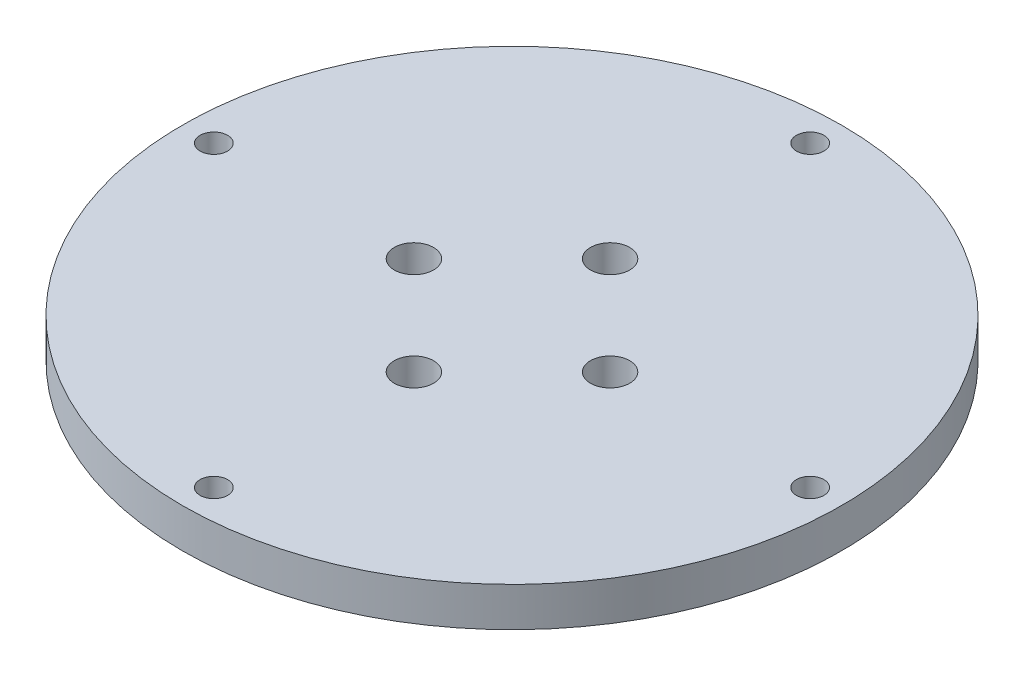
ISO-10303-21;
HEADER;
FILE_DESCRIPTION(('STEP AP214'),'2;1');
FILE_NAME('part.step','',(''),(''),'','','');
FILE_SCHEMA(('AUTOMOTIVE_DESIGN { 1 0 10303 214 1 1 1 1 }'));
ENDSEC;
DATA;
#1=APPLICATION_CONTEXT('core data for automotive mechanical design processes');
#2=APPLICATION_PROTOCOL_DEFINITION('international standard','automotive_design',2000,#1);
#3=PRODUCT_CONTEXT('',#1,'mechanical');
#4=PRODUCT('Part','Part','',(#3));
#5=PRODUCT_RELATED_PRODUCT_CATEGORY('part','',(#4));
#6=PRODUCT_DEFINITION_FORMATION('','',#4);
#7=PRODUCT_DEFINITION_CONTEXT('part definition',#1,'design');
#8=PRODUCT_DEFINITION('design','',#6,#7);
#9=PRODUCT_DEFINITION_SHAPE('','',#8);
#10=(LENGTH_UNIT() NAMED_UNIT(*) SI_UNIT(.MILLI.,.METRE.));
#11=(NAMED_UNIT(*) PLANE_ANGLE_UNIT() SI_UNIT($,.RADIAN.));
#12=(NAMED_UNIT(*) SI_UNIT($,.STERADIAN.) SOLID_ANGLE_UNIT());
#13=UNCERTAINTY_MEASURE_WITH_UNIT(LENGTH_MEASURE(1.E-05),#10,'distance_accuracy_value','');
#14=(GEOMETRIC_REPRESENTATION_CONTEXT(3) GLOBAL_UNCERTAINTY_ASSIGNED_CONTEXT((#13)) GLOBAL_UNIT_ASSIGNED_CONTEXT((#10,
#11,#12)) REPRESENTATION_CONTEXT('',''));
#15=CARTESIAN_POINT('',(0.,0.,0.));
#16=DIRECTION('',(0.,0.,1.));
#17=DIRECTION('',(1.,0.,0.));
#18=AXIS2_PLACEMENT_3D('',#15,#16,#17);
#19=CARTESIAN_POINT('',(0.,10.,0.));
#20=DIRECTION('',(0.,-1.,0.));
#21=DIRECTION('',(0.,0.,-1.));
#22=AXIS2_PLACEMENT_3D('',#19,#20,#21);
#23=CYLINDRICAL_SURFACE('',#22,84.);
#24=CARTESIAN_POINT('',(0.,10.,0.));
#25=DIRECTION('',(0.,1.,0.));
#26=DIRECTION('',(0.,0.,1.));
#27=AXIS2_PLACEMENT_3D('',#24,#25,#26);
#28=CIRCLE('',#27,84.);
#29=CARTESIAN_POINT('',(0.,10.,84.));
#30=VERTEX_POINT('',#29);
#31=EDGE_CURVE('E10',#30,#30,#28,.T.);
#32=ORIENTED_EDGE('',*,*,#31,.F.);
#33=EDGE_LOOP('',(#32));
#34=FACE_BOUND('',#33,.T.);
#35=CARTESIAN_POINT('',(0.,0.,0.));
#36=DIRECTION('',(0.,1.,0.));
#37=DIRECTION('',(0.,0.,1.));
#38=AXIS2_PLACEMENT_3D('',#35,#36,#37);
#39=CIRCLE('',#38,84.);
#40=CARTESIAN_POINT('',(0.,0.,84.));
#41=VERTEX_POINT('',#40);
#42=EDGE_CURVE('E34',#41,#41,#39,.T.);
#43=ORIENTED_EDGE('',*,*,#42,.T.);
#44=EDGE_LOOP('',(#43));
#45=FACE_BOUND('',#44,.T.);
#46=ADVANCED_FACE('F31',(#34,#45),#23,.T.);
#47=CARTESIAN_POINT('',(0.,10.,0.));
#48=DIRECTION('',(0.,1.,0.));
#49=DIRECTION('',(0.,0.,1.));
#50=AXIS2_PLACEMENT_3D('',#47,#48,#49);
#51=PLANE('',#50);
#52=CARTESIAN_POINT('',(0.,10.,-25.));
#53=DIRECTION('',(0.,1.,0.));
#54=DIRECTION('',(0.,0.,1.));
#55=AXIS2_PLACEMENT_3D('',#52,#53,#54);
#56=CIRCLE('',#55,5.);
#57=CARTESIAN_POINT('',(0.,10.,-20.));
#58=VERTEX_POINT('',#57);
#59=EDGE_CURVE('E85',#58,#58,#56,.T.);
#60=ORIENTED_EDGE('',*,*,#59,.F.);
#61=EDGE_LOOP('',(#60));
#62=FACE_BOUND('',#61,.T.);
#63=CARTESIAN_POINT('',(25.,10.,0.));
#64=DIRECTION('',(0.,1.,0.));
#65=DIRECTION('',(0.,0.,1.));
#66=AXIS2_PLACEMENT_3D('',#63,#64,#65);
#67=CIRCLE('',#66,5.);
#68=CARTESIAN_POINT('',(25.,10.,5.));
#69=VERTEX_POINT('',#68);
#70=EDGE_CURVE('E79',#69,#69,#67,.T.);
#71=ORIENTED_EDGE('',*,*,#70,.F.);
#72=EDGE_LOOP('',(#71));
#73=FACE_BOUND('',#72,.T.);
#74=CARTESIAN_POINT('',(-25.,10.,0.));
#75=DIRECTION('',(0.,1.,0.));
#76=DIRECTION('',(0.,0.,1.));
#77=AXIS2_PLACEMENT_3D('',#74,#75,#76);
#78=CIRCLE('',#77,5.);
#79=CARTESIAN_POINT('',(-25.,10.,5.));
#80=VERTEX_POINT('',#79);
#81=EDGE_CURVE('E73',#80,#80,#78,.T.);
#82=ORIENTED_EDGE('',*,*,#81,.F.);
#83=EDGE_LOOP('',(#82));
#84=FACE_BOUND('',#83,.T.);
#85=CARTESIAN_POINT('',(0.,10.,25.));
#86=DIRECTION('',(0.,1.,0.));
#87=DIRECTION('',(0.,0.,1.));
#88=AXIS2_PLACEMENT_3D('',#85,#86,#87);
#89=CIRCLE('',#88,5.);
#90=CARTESIAN_POINT('',(0.,10.,30.));
#91=VERTEX_POINT('',#90);
#92=EDGE_CURVE('E67',#91,#91,#89,.T.);
#93=ORIENTED_EDGE('',*,*,#92,.F.);
#94=EDGE_LOOP('',(#93));
#95=FACE_BOUND('',#94,.T.);
#96=CARTESIAN_POINT('',(0.,10.,-76.));
#97=DIRECTION('',(0.,1.,0.));
#98=DIRECTION('',(0.,0.,1.));
#99=AXIS2_PLACEMENT_3D('',#96,#97,#98);
#100=CIRCLE('',#99,3.49999999999999);
#101=CARTESIAN_POINT('',(0.,10.,-72.5));
#102=VERTEX_POINT('',#101);
#103=EDGE_CURVE('E63',#102,#102,#100,.T.);
#104=ORIENTED_EDGE('',*,*,#103,.F.);
#105=EDGE_LOOP('',(#104));
#106=FACE_BOUND('',#105,.T.);
#107=CARTESIAN_POINT('',(-76.,10.,0.));
#108=DIRECTION('',(0.,1.,0.));
#109=DIRECTION('',(0.,0.,1.));
#110=AXIS2_PLACEMENT_3D('',#107,#108,#109);
#111=CIRCLE('',#110,3.49999999999999);
#112=CARTESIAN_POINT('',(-76.,10.,3.49999999999999));
#113=VERTEX_POINT('',#112);
#114=EDGE_CURVE('E57',#113,#113,#111,.T.);
#115=ORIENTED_EDGE('',*,*,#114,.F.);
#116=EDGE_LOOP('',(#115));
#117=FACE_BOUND('',#116,.T.);
#118=CARTESIAN_POINT('',(0.,10.,76.));
#119=DIRECTION('',(0.,1.,0.));
#120=DIRECTION('',(0.,0.,1.));
#121=AXIS2_PLACEMENT_3D('',#118,#119,#120);
#122=CIRCLE('',#121,3.49999999999999);
#123=CARTESIAN_POINT('',(0.,10.,79.5));
#124=VERTEX_POINT('',#123);
#125=EDGE_CURVE('E51',#124,#124,#122,.T.);
#126=ORIENTED_EDGE('',*,*,#125,.F.);
#127=EDGE_LOOP('',(#126));
#128=FACE_BOUND('',#127,.T.);
#129=CARTESIAN_POINT('',(76.,10.,0.));
#130=DIRECTION('',(0.,1.,0.));
#131=DIRECTION('',(0.,0.,1.));
#132=AXIS2_PLACEMENT_3D('',#129,#130,#131);
#133=CIRCLE('',#132,3.49999999999999);
#134=CARTESIAN_POINT('',(76.,10.,3.49999999999999));
#135=VERTEX_POINT('',#134);
#136=EDGE_CURVE('E45',#135,#135,#133,.T.);
#137=ORIENTED_EDGE('',*,*,#136,.F.);
#138=EDGE_LOOP('',(#137));
#139=FACE_BOUND('',#138,.T.);
#140=ORIENTED_EDGE('',*,*,#31,.T.);
#141=EDGE_LOOP('',(#140));
#142=FACE_BOUND('',#141,.T.);
#143=ADVANCED_FACE('F101',(#62,#73,#84,#95,#106,#117,#128,#139,#142),#51,.T.);
#144=CARTESIAN_POINT('',(0.,0.,0.));
#145=DIRECTION('',(0.,1.,0.));
#146=DIRECTION('',(0.,0.,1.));
#147=AXIS2_PLACEMENT_3D('',#144,#145,#146);
#148=PLANE('',#147);
#149=CARTESIAN_POINT('',(0.,0.,-25.));
#150=DIRECTION('',(0.,1.,0.));
#151=DIRECTION('',(0.,0.,1.));
#152=AXIS2_PLACEMENT_3D('',#149,#150,#151);
#153=CIRCLE('',#152,5.);
#154=CARTESIAN_POINT('',(0.,0.,-20.));
#155=VERTEX_POINT('',#154);
#156=EDGE_CURVE('E66',#155,#155,#153,.T.);
#157=ORIENTED_EDGE('',*,*,#156,.T.);
#158=EDGE_LOOP('',(#157));
#159=FACE_BOUND('',#158,.T.);
#160=CARTESIAN_POINT('',(25.,0.,0.));
#161=DIRECTION('',(0.,1.,0.));
#162=DIRECTION('',(0.,0.,1.));
#163=AXIS2_PLACEMENT_3D('',#160,#161,#162);
#164=CIRCLE('',#163,5.);
#165=CARTESIAN_POINT('',(25.,0.,5.));
#166=VERTEX_POINT('',#165);
#167=EDGE_CURVE('E82',#166,#166,#164,.T.);
#168=ORIENTED_EDGE('',*,*,#167,.T.);
#169=EDGE_LOOP('',(#168));
#170=FACE_BOUND('',#169,.T.);
#171=CARTESIAN_POINT('',(-25.,0.,0.));
#172=DIRECTION('',(0.,1.,0.));
#173=DIRECTION('',(0.,0.,1.));
#174=AXIS2_PLACEMENT_3D('',#171,#172,#173);
#175=CIRCLE('',#174,5.);
#176=CARTESIAN_POINT('',(-25.,0.,5.));
#177=VERTEX_POINT('',#176);
#178=EDGE_CURVE('E76',#177,#177,#175,.T.);
#179=ORIENTED_EDGE('',*,*,#178,.T.);
#180=EDGE_LOOP('',(#179));
#181=FACE_BOUND('',#180,.T.);
#182=CARTESIAN_POINT('',(0.,0.,25.));
#183=DIRECTION('',(0.,1.,0.));
#184=DIRECTION('',(0.,0.,1.));
#185=AXIS2_PLACEMENT_3D('',#182,#183,#184);
#186=CIRCLE('',#185,5.);
#187=CARTESIAN_POINT('',(0.,0.,30.));
#188=VERTEX_POINT('',#187);
#189=EDGE_CURVE('E70',#188,#188,#186,.T.);
#190=ORIENTED_EDGE('',*,*,#189,.T.);
#191=EDGE_LOOP('',(#190));
#192=FACE_BOUND('',#191,.T.);
#193=CARTESIAN_POINT('',(0.,0.,-76.));
#194=DIRECTION('',(0.,1.,0.));
#195=DIRECTION('',(0.,0.,1.));
#196=AXIS2_PLACEMENT_3D('',#193,#194,#195);
#197=CIRCLE('',#196,3.49999999999999);
#198=CARTESIAN_POINT('',(0.,0.,-72.5));
#199=VERTEX_POINT('',#198);
#200=EDGE_CURVE('E60',#199,#199,#197,.T.);
#201=ORIENTED_EDGE('',*,*,#200,.T.);
#202=EDGE_LOOP('',(#201));
#203=FACE_BOUND('',#202,.T.);
#204=CARTESIAN_POINT('',(-76.,0.,0.));
#205=DIRECTION('',(0.,1.,0.));
#206=DIRECTION('',(0.,0.,1.));
#207=AXIS2_PLACEMENT_3D('',#204,#205,#206);
#208=CIRCLE('',#207,3.49999999999999);
#209=CARTESIAN_POINT('',(-76.,0.,3.49999999999999));
#210=VERTEX_POINT('',#209);
#211=EDGE_CURVE('E54',#210,#210,#208,.T.);
#212=ORIENTED_EDGE('',*,*,#211,.T.);
#213=EDGE_LOOP('',(#212));
#214=FACE_BOUND('',#213,.T.);
#215=CARTESIAN_POINT('',(0.,0.,76.));
#216=DIRECTION('',(0.,1.,0.));
#217=DIRECTION('',(0.,0.,1.));
#218=AXIS2_PLACEMENT_3D('',#215,#216,#217);
#219=CIRCLE('',#218,3.49999999999999);
#220=CARTESIAN_POINT('',(0.,0.,79.5));
#221=VERTEX_POINT('',#220);
#222=EDGE_CURVE('E48',#221,#221,#219,.T.);
#223=ORIENTED_EDGE('',*,*,#222,.T.);
#224=EDGE_LOOP('',(#223));
#225=FACE_BOUND('',#224,.T.);
#226=CARTESIAN_POINT('',(76.,0.,0.));
#227=DIRECTION('',(0.,1.,0.));
#228=DIRECTION('',(0.,0.,1.));
#229=AXIS2_PLACEMENT_3D('',#226,#227,#228);
#230=CIRCLE('',#229,3.49999999999999);
#231=CARTESIAN_POINT('',(76.,0.,3.49999999999999));
#232=VERTEX_POINT('',#231);
#233=EDGE_CURVE('E41',#232,#232,#230,.T.);
#234=ORIENTED_EDGE('',*,*,#233,.T.);
#235=EDGE_LOOP('',(#234));
#236=FACE_BOUND('',#235,.T.);
#237=ORIENTED_EDGE('',*,*,#42,.F.);
#238=EDGE_LOOP('',(#237));
#239=FACE_BOUND('',#238,.T.);
#240=ADVANCED_FACE('F91',(#159,#170,#181,#192,#203,#214,#225,#236,#239),#148,.F.);
#241=CARTESIAN_POINT('',(76.,10.,0.));
#242=DIRECTION('',(0.,1.,0.));
#243=DIRECTION('',(0.,0.,1.));
#244=AXIS2_PLACEMENT_3D('',#241,#242,#243);
#245=CYLINDRICAL_SURFACE('',#244,3.49999999999999);
#246=ORIENTED_EDGE('',*,*,#233,.F.);
#247=EDGE_LOOP('',(#246));
#248=FACE_BOUND('',#247,.T.);
#249=ORIENTED_EDGE('',*,*,#136,.T.);
#250=EDGE_LOOP('',(#249));
#251=FACE_BOUND('',#250,.T.);
#252=ADVANCED_FACE('F119',(#248,#251),#245,.F.);
#253=CARTESIAN_POINT('',(0.,10.,76.));
#254=DIRECTION('',(0.,1.,0.));
#255=DIRECTION('',(0.,0.,1.));
#256=AXIS2_PLACEMENT_3D('',#253,#254,#255);
#257=CYLINDRICAL_SURFACE('',#256,3.49999999999999);
#258=ORIENTED_EDGE('',*,*,#222,.F.);
#259=EDGE_LOOP('',(#258));
#260=FACE_BOUND('',#259,.T.);
#261=ORIENTED_EDGE('',*,*,#125,.T.);
#262=EDGE_LOOP('',(#261));
#263=FACE_BOUND('',#262,.T.);
#264=ADVANCED_FACE('F121',(#260,#263),#257,.F.);
#265=CARTESIAN_POINT('',(-76.,10.,0.));
#266=DIRECTION('',(0.,1.,0.));
#267=DIRECTION('',(0.,0.,1.));
#268=AXIS2_PLACEMENT_3D('',#265,#266,#267);
#269=CYLINDRICAL_SURFACE('',#268,3.49999999999999);
#270=ORIENTED_EDGE('',*,*,#211,.F.);
#271=EDGE_LOOP('',(#270));
#272=FACE_BOUND('',#271,.T.);
#273=ORIENTED_EDGE('',*,*,#114,.T.);
#274=EDGE_LOOP('',(#273));
#275=FACE_BOUND('',#274,.T.);
#276=ADVANCED_FACE('F128',(#272,#275),#269,.F.);
#277=CARTESIAN_POINT('',(0.,10.,-76.));
#278=DIRECTION('',(0.,1.,0.));
#279=DIRECTION('',(0.,0.,1.));
#280=AXIS2_PLACEMENT_3D('',#277,#278,#279);
#281=CYLINDRICAL_SURFACE('',#280,3.49999999999999);
#282=ORIENTED_EDGE('',*,*,#200,.F.);
#283=EDGE_LOOP('',(#282));
#284=FACE_BOUND('',#283,.T.);
#285=ORIENTED_EDGE('',*,*,#103,.T.);
#286=EDGE_LOOP('',(#285));
#287=FACE_BOUND('',#286,.T.);
#288=ADVANCED_FACE('F160',(#284,#287),#281,.F.);
#289=CARTESIAN_POINT('',(0.,0.,25.));
#290=DIRECTION('',(0.,1.,0.));
#291=DIRECTION('',(0.,0.,1.));
#292=AXIS2_PLACEMENT_3D('',#289,#290,#291);
#293=CYLINDRICAL_SURFACE('',#292,5.);
#294=ORIENTED_EDGE('',*,*,#189,.F.);
#295=EDGE_LOOP('',(#294));
#296=FACE_BOUND('',#295,.T.);
#297=ORIENTED_EDGE('',*,*,#92,.T.);
#298=EDGE_LOOP('',(#297));
#299=FACE_BOUND('',#298,.T.);
#300=ADVANCED_FACE('F154',(#296,#299),#293,.F.);
#301=CARTESIAN_POINT('',(-25.,0.,0.));
#302=DIRECTION('',(0.,1.,0.));
#303=DIRECTION('',(0.,0.,1.));
#304=AXIS2_PLACEMENT_3D('',#301,#302,#303);
#305=CYLINDRICAL_SURFACE('',#304,5.);
#306=ORIENTED_EDGE('',*,*,#178,.F.);
#307=EDGE_LOOP('',(#306));
#308=FACE_BOUND('',#307,.T.);
#309=ORIENTED_EDGE('',*,*,#81,.T.);
#310=EDGE_LOOP('',(#309));
#311=FACE_BOUND('',#310,.T.);
#312=ADVANCED_FACE('F159',(#308,#311),#305,.F.);
#313=CARTESIAN_POINT('',(25.,0.,0.));
#314=DIRECTION('',(0.,1.,0.));
#315=DIRECTION('',(0.,0.,1.));
#316=AXIS2_PLACEMENT_3D('',#313,#314,#315);
#317=CYLINDRICAL_SURFACE('',#316,5.);
#318=ORIENTED_EDGE('',*,*,#167,.F.);
#319=EDGE_LOOP('',(#318));
#320=FACE_BOUND('',#319,.T.);
#321=ORIENTED_EDGE('',*,*,#70,.T.);
#322=EDGE_LOOP('',(#321));
#323=FACE_BOUND('',#322,.T.);
#324=ADVANCED_FACE('F97',(#320,#323),#317,.F.);
#325=CARTESIAN_POINT('',(0.,0.,-25.));
#326=DIRECTION('',(0.,1.,0.));
#327=DIRECTION('',(0.,0.,1.));
#328=AXIS2_PLACEMENT_3D('',#325,#326,#327);
#329=CYLINDRICAL_SURFACE('',#328,5.);
#330=ORIENTED_EDGE('',*,*,#156,.F.);
#331=EDGE_LOOP('',(#330));
#332=FACE_BOUND('',#331,.T.);
#333=ORIENTED_EDGE('',*,*,#59,.T.);
#334=EDGE_LOOP('',(#333));
#335=FACE_BOUND('',#334,.T.);
#336=ADVANCED_FACE('F94',(#332,#335),#329,.F.);
#337=CLOSED_SHELL('',(#46,#143,#240,#252,#264,#276,#288,#300,#312,#324,#336));
#338=MANIFOLD_SOLID_BREP('B2',#337);
#339=ADVANCED_BREP_SHAPE_REPRESENTATION('',(#18,#338),#14);
#340=SHAPE_DEFINITION_REPRESENTATION(#9,#339);
ENDSEC;
END-ISO-10303-21;
